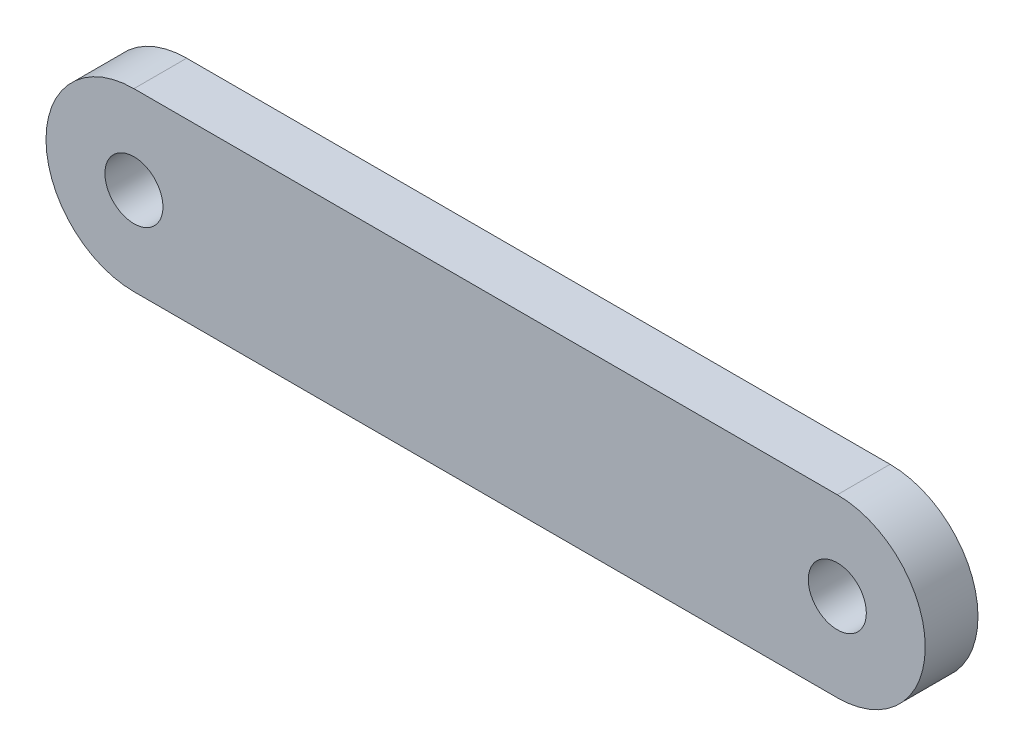
ISO-10303-21;
HEADER;
FILE_DESCRIPTION(('STEP AP214'),'2;1');
FILE_NAME('part.step','',(''),(''),'','','');
FILE_SCHEMA(('AUTOMOTIVE_DESIGN { 1 0 10303 214 1 1 1 1 }'));
ENDSEC;
DATA;
#1=APPLICATION_CONTEXT('core data for automotive mechanical design processes');
#2=APPLICATION_PROTOCOL_DEFINITION('international standard','automotive_design',2000,#1);
#3=PRODUCT_CONTEXT('',#1,'mechanical');
#4=PRODUCT('Part','Part','',(#3));
#5=PRODUCT_RELATED_PRODUCT_CATEGORY('part','',(#4));
#6=PRODUCT_DEFINITION_FORMATION('','',#4);
#7=PRODUCT_DEFINITION_CONTEXT('part definition',#1,'design');
#8=PRODUCT_DEFINITION('design','',#6,#7);
#9=PRODUCT_DEFINITION_SHAPE('','',#8);
#10=(LENGTH_UNIT() NAMED_UNIT(*) SI_UNIT(.MILLI.,.METRE.));
#11=(NAMED_UNIT(*) PLANE_ANGLE_UNIT() SI_UNIT($,.RADIAN.));
#12=(NAMED_UNIT(*) SI_UNIT($,.STERADIAN.) SOLID_ANGLE_UNIT());
#13=UNCERTAINTY_MEASURE_WITH_UNIT(LENGTH_MEASURE(1.E-05),#10,'distance_accuracy_value','');
#14=(GEOMETRIC_REPRESENTATION_CONTEXT(3) GLOBAL_UNCERTAINTY_ASSIGNED_CONTEXT((#13)) GLOBAL_UNIT_ASSIGNED_CONTEXT((#10,
#11,#12)) REPRESENTATION_CONTEXT('',''));
#15=CARTESIAN_POINT('',(0.,0.,0.));
#16=DIRECTION('',(0.,0.,1.));
#17=DIRECTION('',(1.,0.,0.));
#18=AXIS2_PLACEMENT_3D('',#15,#16,#17);
#19=CARTESIAN_POINT('',(0.,-5.,3.));
#20=DIRECTION('',(0.,0.,1.));
#21=DIRECTION('',(1.,0.,0.));
#22=AXIS2_PLACEMENT_3D('',#19,#20,#21);
#23=PLANE('',#22);
#24=CARTESIAN_POINT('',(0.,-5.,3.));
#25=DIRECTION('',(0.,0.,1.));
#26=DIRECTION('',(1.,0.,0.));
#27=AXIS2_PLACEMENT_3D('',#24,#25,#26);
#28=CIRCLE('',#27,1.65);
#29=CARTESIAN_POINT('',(1.65,-5.,3.));
#30=VERTEX_POINT('',#29);
#31=EDGE_CURVE('E102',#30,#30,#28,.T.);
#32=ORIENTED_EDGE('',*,*,#31,.F.);
#33=EDGE_LOOP('',(#32));
#34=FACE_BOUND('',#33,.T.);
#35=CARTESIAN_POINT('',(0.,-5.,3.));
#36=DIRECTION('',(0.,0.,1.));
#37=DIRECTION('',(1.,0.,0.));
#38=AXIS2_PLACEMENT_3D('',#35,#36,#37);
#39=CIRCLE('',#38,5.);
#40=CARTESIAN_POINT('',(0.,0.,3.));
#41=VERTEX_POINT('',#40);
#42=CARTESIAN_POINT('',(0.,-10.,3.));
#43=VERTEX_POINT('',#42);
#44=EDGE_CURVE('E87',#41,#43,#39,.T.);
#45=ORIENTED_EDGE('',*,*,#44,.T.);
#46=DIRECTION('',(1.,0.,0.));
#47=VECTOR('',#46,1.);
#48=CARTESIAN_POINT('',(0.,-10.,3.));
#49=LINE('',#48,#47);
#50=CARTESIAN_POINT('',(40.,-10.,3.));
#51=VERTEX_POINT('',#50);
#52=EDGE_CURVE('E82',#43,#51,#49,.T.);
#53=ORIENTED_EDGE('',*,*,#52,.T.);
#54=CARTESIAN_POINT('',(40.,-5.,3.));
#55=DIRECTION('',(0.,0.,1.));
#56=DIRECTION('',(-1.,0.,0.));
#57=AXIS2_PLACEMENT_3D('',#54,#55,#56);
#58=CIRCLE('',#57,5.);
#59=CARTESIAN_POINT('',(40.,0.,3.));
#60=VERTEX_POINT('',#59);
#61=EDGE_CURVE('E85',#51,#60,#58,.T.);
#62=ORIENTED_EDGE('',*,*,#61,.T.);
#63=DIRECTION('',(-1.,0.,0.));
#64=VECTOR('',#63,1.);
#65=CARTESIAN_POINT('',(0.,0.,3.));
#66=LINE('',#65,#64);
#67=EDGE_CURVE('E52',#60,#41,#66,.T.);
#68=ORIENTED_EDGE('',*,*,#67,.T.);
#69=EDGE_LOOP('',(#45,#53,#62,#68));
#70=FACE_BOUND('',#69,.T.);
#71=CARTESIAN_POINT('',(40.,-5.,3.));
#72=DIRECTION('',(0.,0.,1.));
#73=DIRECTION('',(1.,0.,0.));
#74=AXIS2_PLACEMENT_3D('',#71,#72,#73);
#75=CIRCLE('',#74,1.65);
#76=CARTESIAN_POINT('',(41.65,-5.,3.));
#77=VERTEX_POINT('',#76);
#78=EDGE_CURVE('E117',#77,#77,#75,.T.);
#79=ORIENTED_EDGE('',*,*,#78,.F.);
#80=EDGE_LOOP('',(#79));
#81=FACE_BOUND('',#80,.T.);
#82=ADVANCED_FACE('F35',(#34,#70,#81),#23,.T.);
#83=CARTESIAN_POINT('',(0.,-5.,0.));
#84=DIRECTION('',(0.,0.,1.));
#85=DIRECTION('',(1.,0.,0.));
#86=AXIS2_PLACEMENT_3D('',#83,#84,#85);
#87=PLANE('',#86);
#88=CARTESIAN_POINT('',(0.,-5.,0.));
#89=DIRECTION('',(0.,0.,1.));
#90=DIRECTION('',(1.,0.,0.));
#91=AXIS2_PLACEMENT_3D('',#88,#89,#90);
#92=CIRCLE('',#91,5.);
#93=CARTESIAN_POINT('',(0.,0.,0.));
#94=VERTEX_POINT('',#93);
#95=CARTESIAN_POINT('',(0.,-10.,0.));
#96=VERTEX_POINT('',#95);
#97=EDGE_CURVE('E99',#94,#96,#92,.T.);
#98=ORIENTED_EDGE('',*,*,#97,.F.);
#99=DIRECTION('',(-1.,0.,0.));
#100=VECTOR('',#99,1.);
#101=CARTESIAN_POINT('',(0.,0.,0.));
#102=LINE('',#101,#100);
#103=CARTESIAN_POINT('',(40.,0.,0.));
#104=VERTEX_POINT('',#103);
#105=EDGE_CURVE('E75',#104,#94,#102,.T.);
#106=ORIENTED_EDGE('',*,*,#105,.F.);
#107=CARTESIAN_POINT('',(40.,-5.,0.));
#108=DIRECTION('',(0.,0.,1.));
#109=DIRECTION('',(-1.,0.,0.));
#110=AXIS2_PLACEMENT_3D('',#107,#108,#109);
#111=CIRCLE('',#110,5.);
#112=CARTESIAN_POINT('',(40.,-10.,0.));
#113=VERTEX_POINT('',#112);
#114=EDGE_CURVE('E69',#113,#104,#111,.T.);
#115=ORIENTED_EDGE('',*,*,#114,.F.);
#116=DIRECTION('',(1.,0.,0.));
#117=VECTOR('',#116,1.);
#118=CARTESIAN_POINT('',(0.,-10.,0.));
#119=LINE('',#118,#117);
#120=EDGE_CURVE('E91',#96,#113,#119,.T.);
#121=ORIENTED_EDGE('',*,*,#120,.F.);
#122=EDGE_LOOP('',(#98,#106,#115,#121));
#123=FACE_BOUND('',#122,.T.);
#124=CARTESIAN_POINT('',(0.,-5.,0.));
#125=DIRECTION('',(0.,0.,1.));
#126=DIRECTION('',(1.,0.,0.));
#127=AXIS2_PLACEMENT_3D('',#124,#125,#126);
#128=CIRCLE('',#127,1.65);
#129=CARTESIAN_POINT('',(1.65,-5.,0.));
#130=VERTEX_POINT('',#129);
#131=EDGE_CURVE('E114',#130,#130,#128,.T.);
#132=ORIENTED_EDGE('',*,*,#131,.T.);
#133=EDGE_LOOP('',(#132));
#134=FACE_BOUND('',#133,.T.);
#135=CARTESIAN_POINT('',(40.,-5.,0.));
#136=DIRECTION('',(0.,0.,1.));
#137=DIRECTION('',(1.,0.,0.));
#138=AXIS2_PLACEMENT_3D('',#135,#136,#137);
#139=CIRCLE('',#138,1.65);
#140=CARTESIAN_POINT('',(41.65,-5.,0.));
#141=VERTEX_POINT('',#140);
#142=EDGE_CURVE('E120',#141,#141,#139,.T.);
#143=ORIENTED_EDGE('',*,*,#142,.T.);
#144=EDGE_LOOP('',(#143));
#145=FACE_BOUND('',#144,.T.);
#146=ADVANCED_FACE('F110',(#123,#134,#145),#87,.F.);
#147=CARTESIAN_POINT('',(0.,-5.,3.));
#148=DIRECTION('',(0.,0.,-1.));
#149=DIRECTION('',(-1.,0.,0.));
#150=AXIS2_PLACEMENT_3D('',#147,#148,#149);
#151=CYLINDRICAL_SURFACE('',#150,5.);
#152=ORIENTED_EDGE('',*,*,#97,.T.);
#153=DIRECTION('',(0.,0.,-1.));
#154=VECTOR('',#153,1.);
#155=CARTESIAN_POINT('',(0.,-10.,3.));
#156=LINE('',#155,#154);
#157=EDGE_CURVE('E11',#43,#96,#156,.T.);
#158=ORIENTED_EDGE('',*,*,#157,.F.);
#159=ORIENTED_EDGE('',*,*,#44,.F.);
#160=DIRECTION('',(0.,0.,-1.));
#161=VECTOR('',#160,1.);
#162=CARTESIAN_POINT('',(0.,0.,3.));
#163=LINE('',#162,#161);
#164=EDGE_CURVE('E95',#41,#94,#163,.T.);
#165=ORIENTED_EDGE('',*,*,#164,.T.);
#166=EDGE_LOOP('',(#152,#158,#159,#165));
#167=FACE_BOUND('',#166,.T.);
#168=ADVANCED_FACE('F37',(#167),#151,.T.);
#169=CARTESIAN_POINT('',(0.,-10.,3.));
#170=DIRECTION('',(0.,1.,0.));
#171=DIRECTION('',(0.,0.,1.));
#172=AXIS2_PLACEMENT_3D('',#169,#170,#171);
#173=PLANE('',#172);
#174=ORIENTED_EDGE('',*,*,#120,.T.);
#175=DIRECTION('',(0.,0.,-1.));
#176=VECTOR('',#175,1.);
#177=CARTESIAN_POINT('',(40.,-10.,3.));
#178=LINE('',#177,#176);
#179=EDGE_CURVE('E44',#51,#113,#178,.T.);
#180=ORIENTED_EDGE('',*,*,#179,.F.);
#181=ORIENTED_EDGE('',*,*,#52,.F.);
#182=ORIENTED_EDGE('',*,*,#157,.T.);
#183=EDGE_LOOP('',(#174,#180,#181,#182));
#184=FACE_BOUND('',#183,.T.);
#185=ADVANCED_FACE('F90',(#184),#173,.F.);
#186=CARTESIAN_POINT('',(40.,-5.,3.));
#187=DIRECTION('',(0.,0.,-1.));
#188=DIRECTION('',(-1.,0.,0.));
#189=AXIS2_PLACEMENT_3D('',#186,#187,#188);
#190=CYLINDRICAL_SURFACE('',#189,5.);
#191=ORIENTED_EDGE('',*,*,#114,.T.);
#192=DIRECTION('',(0.,0.,-1.));
#193=VECTOR('',#192,1.);
#194=CARTESIAN_POINT('',(40.,0.,3.));
#195=LINE('',#194,#193);
#196=EDGE_CURVE('E92',#60,#104,#195,.T.);
#197=ORIENTED_EDGE('',*,*,#196,.F.);
#198=ORIENTED_EDGE('',*,*,#61,.F.);
#199=ORIENTED_EDGE('',*,*,#179,.T.);
#200=EDGE_LOOP('',(#191,#197,#198,#199));
#201=FACE_BOUND('',#200,.T.);
#202=ADVANCED_FACE('F93',(#201),#190,.T.);
#203=CARTESIAN_POINT('',(0.,0.,3.));
#204=DIRECTION('',(0.,-1.,0.));
#205=DIRECTION('',(0.,0.,-1.));
#206=AXIS2_PLACEMENT_3D('',#203,#204,#205);
#207=PLANE('',#206);
#208=ORIENTED_EDGE('',*,*,#105,.T.);
#209=ORIENTED_EDGE('',*,*,#164,.F.);
#210=ORIENTED_EDGE('',*,*,#67,.F.);
#211=ORIENTED_EDGE('',*,*,#196,.T.);
#212=EDGE_LOOP('',(#208,#209,#210,#211));
#213=FACE_BOUND('',#212,.T.);
#214=ADVANCED_FACE('F107',(#213),#207,.F.);
#215=CARTESIAN_POINT('',(0.,-5.,3.));
#216=DIRECTION('',(0.,0.,-1.));
#217=DIRECTION('',(-1.,0.,0.));
#218=AXIS2_PLACEMENT_3D('',#215,#216,#217);
#219=CYLINDRICAL_SURFACE('',#218,1.65);
#220=ORIENTED_EDGE('',*,*,#31,.T.);
#221=EDGE_LOOP('',(#220));
#222=FACE_BOUND('',#221,.T.);
#223=ORIENTED_EDGE('',*,*,#131,.F.);
#224=EDGE_LOOP('',(#223));
#225=FACE_BOUND('',#224,.T.);
#226=ADVANCED_FACE('F137',(#222,#225),#219,.F.);
#227=CARTESIAN_POINT('',(40.,-5.,3.));
#228=DIRECTION('',(0.,0.,-1.));
#229=DIRECTION('',(-1.,0.,0.));
#230=AXIS2_PLACEMENT_3D('',#227,#228,#229);
#231=CYLINDRICAL_SURFACE('',#230,1.65);
#232=ORIENTED_EDGE('',*,*,#78,.T.);
#233=EDGE_LOOP('',(#232));
#234=FACE_BOUND('',#233,.T.);
#235=ORIENTED_EDGE('',*,*,#142,.F.);
#236=EDGE_LOOP('',(#235));
#237=FACE_BOUND('',#236,.T.);
#238=ADVANCED_FACE('F126',(#234,#237),#231,.F.);
#239=CLOSED_SHELL('',(#82,#146,#168,#185,#202,#214,#226,#238));
#240=MANIFOLD_SOLID_BREP('B2',#239);
#241=ADVANCED_BREP_SHAPE_REPRESENTATION('',(#18,#240),#14);
#242=SHAPE_DEFINITION_REPRESENTATION(#9,#241);
ENDSEC;
END-ISO-10303-21;
